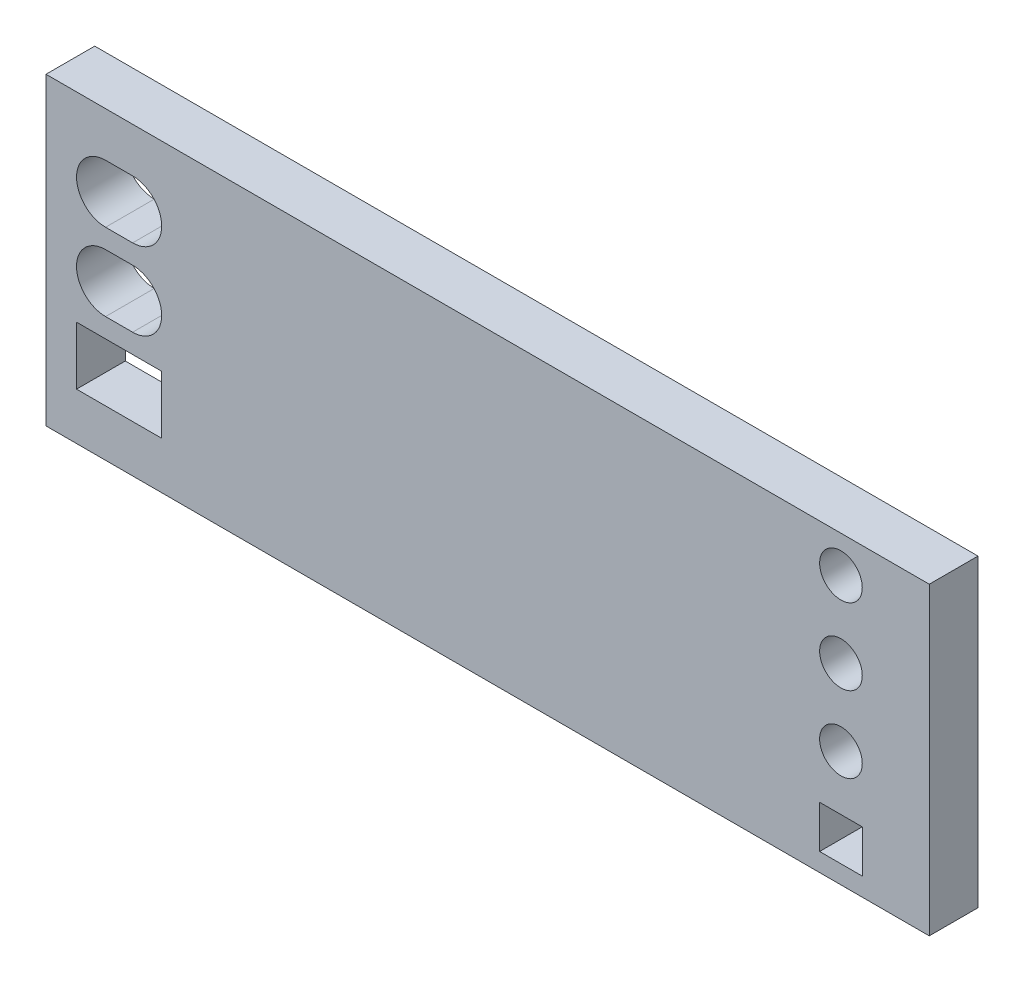
ISO-10303-21;
HEADER;
FILE_DESCRIPTION(('STEP AP214'),'2;1');
FILE_NAME('part.step','',(''),(''),'','','');
FILE_SCHEMA(('AUTOMOTIVE_DESIGN { 1 0 10303 214 1 1 1 1 }'));
ENDSEC;
DATA;
#1=APPLICATION_CONTEXT('core data for automotive mechanical design processes');
#2=APPLICATION_PROTOCOL_DEFINITION('international standard','automotive_design',2000,#1);
#3=PRODUCT_CONTEXT('',#1,'mechanical');
#4=PRODUCT('Part','Part','',(#3));
#5=PRODUCT_RELATED_PRODUCT_CATEGORY('part','',(#4));
#6=PRODUCT_DEFINITION_FORMATION('','',#4);
#7=PRODUCT_DEFINITION_CONTEXT('part definition',#1,'design');
#8=PRODUCT_DEFINITION('design','',#6,#7);
#9=PRODUCT_DEFINITION_SHAPE('','',#8);
#10=(LENGTH_UNIT() NAMED_UNIT(*) SI_UNIT(.MILLI.,.METRE.));
#11=(NAMED_UNIT(*) PLANE_ANGLE_UNIT() SI_UNIT($,.RADIAN.));
#12=(NAMED_UNIT(*) SI_UNIT($,.STERADIAN.) SOLID_ANGLE_UNIT());
#13=UNCERTAINTY_MEASURE_WITH_UNIT(LENGTH_MEASURE(1.E-05),#10,'distance_accuracy_value','');
#14=(GEOMETRIC_REPRESENTATION_CONTEXT(3) GLOBAL_UNCERTAINTY_ASSIGNED_CONTEXT((#13)) GLOBAL_UNIT_ASSIGNED_CONTEXT((#10,
#11,#12)) REPRESENTATION_CONTEXT('',''));
#15=CARTESIAN_POINT('',(0.,0.,0.));
#16=DIRECTION('',(0.,0.,1.));
#17=DIRECTION('',(1.,0.,0.));
#18=AXIS2_PLACEMENT_3D('',#15,#16,#17);
#19=CARTESIAN_POINT('',(0.,0.,1.6));
#20=DIRECTION('',(0.,0.,-1.));
#21=DIRECTION('',(-1.,0.,0.));
#22=AXIS2_PLACEMENT_3D('',#19,#20,#21);
#23=PLANE('',#22);
#24=DIRECTION('',(0.,1.,0.));
#25=VECTOR('',#24,1.);
#26=CARTESIAN_POINT('',(3.797,3.4525,1.6));
#27=LINE('',#26,#25);
#28=CARTESIAN_POINT('',(3.797,1.5475,1.6));
#29=VERTEX_POINT('',#28);
#30=CARTESIAN_POINT('',(3.797,3.4525,1.6));
#31=VERTEX_POINT('',#30);
#32=EDGE_CURVE('E205',#29,#31,#27,.T.);
#33=ORIENTED_EDGE('',*,*,#32,.F.);
#34=DIRECTION('',(1.,0.,0.));
#35=VECTOR('',#34,1.);
#36=CARTESIAN_POINT('',(3.797,1.5475,1.6));
#37=LINE('',#36,#35);
#38=CARTESIAN_POINT('',(1.003,1.5475,1.6));
#39=VERTEX_POINT('',#38);
#40=EDGE_CURVE('E213',#39,#29,#37,.T.);
#41=ORIENTED_EDGE('',*,*,#40,.F.);
#42=DIRECTION('',(0.,-1.,0.));
#43=VECTOR('',#42,1.);
#44=CARTESIAN_POINT('',(1.003,1.5475,1.6));
#45=LINE('',#44,#43);
#46=CARTESIAN_POINT('',(1.003,3.4525,1.6));
#47=VERTEX_POINT('',#46);
#48=EDGE_CURVE('E210',#47,#39,#45,.T.);
#49=ORIENTED_EDGE('',*,*,#48,.F.);
#50=DIRECTION('',(-1.,0.,0.));
#51=VECTOR('',#50,1.);
#52=CARTESIAN_POINT('',(1.003,3.4525,1.6));
#53=LINE('',#52,#51);
#54=EDGE_CURVE('E207',#31,#47,#53,.T.);
#55=ORIENTED_EDGE('',*,*,#54,.F.);
#56=EDGE_LOOP('',(#33,#41,#49,#55));
#57=FACE_BOUND('',#56,.T.);
#58=CARTESIAN_POINT('',(2.8445,5.04,1.6));
#59=DIRECTION('',(0.,0.,1.));
#60=DIRECTION('',(1.,0.,0.));
#61=AXIS2_PLACEMENT_3D('',#58,#59,#60);
#62=CIRCLE('',#61,0.952499999999999);
#63=CARTESIAN_POINT('',(2.8445,4.0875,1.6));
#64=VERTEX_POINT('',#63);
#65=CARTESIAN_POINT('',(2.8445,5.9925,1.6));
#66=VERTEX_POINT('',#65);
#67=EDGE_CURVE('E267',#64,#66,#62,.T.);
#68=ORIENTED_EDGE('',*,*,#67,.F.);
#69=DIRECTION('',(1.,0.,0.));
#70=VECTOR('',#69,1.);
#71=CARTESIAN_POINT('',(2.8445,4.0875,1.6));
#72=LINE('',#71,#70);
#73=CARTESIAN_POINT('',(1.9555,4.0875,1.6));
#74=VERTEX_POINT('',#73);
#75=EDGE_CURVE('E275',#74,#64,#72,.T.);
#76=ORIENTED_EDGE('',*,*,#75,.F.);
#77=CARTESIAN_POINT('',(1.9555,5.04,1.6));
#78=DIRECTION('',(0.,0.,1.));
#79=DIRECTION('',(1.,0.,0.));
#80=AXIS2_PLACEMENT_3D('',#77,#78,#79);
#81=CIRCLE('',#80,0.952499999999999);
#82=CARTESIAN_POINT('',(1.9555,5.9925,1.6));
#83=VERTEX_POINT('',#82);
#84=EDGE_CURVE('E272',#83,#74,#81,.T.);
#85=ORIENTED_EDGE('',*,*,#84,.F.);
#86=DIRECTION('',(-1.,0.,0.));
#87=VECTOR('',#86,1.);
#88=CARTESIAN_POINT('',(1.9555,5.9925,1.6));
#89=LINE('',#88,#87);
#90=EDGE_CURVE('E269',#66,#83,#89,.T.);
#91=ORIENTED_EDGE('',*,*,#90,.F.);
#92=EDGE_LOOP('',(#68,#76,#85,#91));
#93=FACE_BOUND('',#92,.T.);
#94=DIRECTION('',(1.,0.,0.));
#95=VECTOR('',#94,1.);
#96=CARTESIAN_POINT('',(29.,0.,1.6));
#97=LINE('',#96,#95);
#98=CARTESIAN_POINT('',(0.,0.,1.6));
#99=VERTEX_POINT('',#98);
#100=CARTESIAN_POINT('',(29.,0.,1.6));
#101=VERTEX_POINT('',#100);
#102=EDGE_CURVE('E316',#99,#101,#97,.T.);
#103=ORIENTED_EDGE('',*,*,#102,.T.);
#104=DIRECTION('',(0.,1.,0.));
#105=VECTOR('',#104,1.);
#106=CARTESIAN_POINT('',(29.,10.,1.6));
#107=LINE('',#106,#105);
#108=CARTESIAN_POINT('',(29.,10.,1.6));
#109=VERTEX_POINT('',#108);
#110=EDGE_CURVE('E319',#101,#109,#107,.T.);
#111=ORIENTED_EDGE('',*,*,#110,.T.);
#112=DIRECTION('',(-1.,0.,0.));
#113=VECTOR('',#112,1.);
#114=CARTESIAN_POINT('',(0.,10.,1.6));
#115=LINE('',#114,#113);
#116=CARTESIAN_POINT('',(0.,10.,1.6));
#117=VERTEX_POINT('',#116);
#118=EDGE_CURVE('E322',#109,#117,#115,.T.);
#119=ORIENTED_EDGE('',*,*,#118,.T.);
#120=DIRECTION('',(0.,-1.,0.));
#121=VECTOR('',#120,1.);
#122=CARTESIAN_POINT('',(0.,0.,1.6));
#123=LINE('',#122,#121);
#124=EDGE_CURVE('E324',#117,#99,#123,.T.);
#125=ORIENTED_EDGE('',*,*,#124,.T.);
#126=EDGE_LOOP('',(#103,#111,#119,#125));
#127=FACE_BOUND('',#126,.T.);
#128=CARTESIAN_POINT('',(26.1,3.8,1.6));
#129=DIRECTION('',(0.,0.,1.));
#130=DIRECTION('',(1.,0.,0.));
#131=AXIS2_PLACEMENT_3D('',#128,#129,#130);
#132=CIRCLE('',#131,0.699999999999999);
#133=CARTESIAN_POINT('',(26.8,3.8,1.6));
#134=VERTEX_POINT('',#133);
#135=EDGE_CURVE('E310',#134,#134,#132,.T.);
#136=ORIENTED_EDGE('',*,*,#135,.F.);
#137=EDGE_LOOP('',(#136));
#138=FACE_BOUND('',#137,.T.);
#139=CARTESIAN_POINT('',(26.1,6.3,1.6));
#140=DIRECTION('',(0.,0.,1.));
#141=DIRECTION('',(1.,0.,0.));
#142=AXIS2_PLACEMENT_3D('',#139,#140,#141);
#143=CIRCLE('',#142,0.699999999999999);
#144=CARTESIAN_POINT('',(26.8,6.3,1.6));
#145=VERTEX_POINT('',#144);
#146=EDGE_CURVE('E304',#145,#145,#143,.T.);
#147=ORIENTED_EDGE('',*,*,#146,.F.);
#148=EDGE_LOOP('',(#147));
#149=FACE_BOUND('',#148,.T.);
#150=CARTESIAN_POINT('',(26.1,8.8,1.6));
#151=DIRECTION('',(0.,0.,1.));
#152=DIRECTION('',(1.,0.,0.));
#153=AXIS2_PLACEMENT_3D('',#150,#151,#152);
#154=CIRCLE('',#153,0.699999999999999);
#155=CARTESIAN_POINT('',(26.8,8.8,1.6));
#156=VERTEX_POINT('',#155);
#157=EDGE_CURVE('E298',#156,#156,#154,.T.);
#158=ORIENTED_EDGE('',*,*,#157,.F.);
#159=EDGE_LOOP('',(#158));
#160=FACE_BOUND('',#159,.T.);
#161=CARTESIAN_POINT('',(2.8445,7.58,1.6));
#162=DIRECTION('',(0.,0.,1.));
#163=DIRECTION('',(1.,0.,0.));
#164=AXIS2_PLACEMENT_3D('',#161,#162,#163);
#165=CIRCLE('',#164,0.9525);
#166=CARTESIAN_POINT('',(2.8445,6.6275,1.6));
#167=VERTEX_POINT('',#166);
#168=CARTESIAN_POINT('',(2.8445,8.5325,1.6));
#169=VERTEX_POINT('',#168);
#170=EDGE_CURVE('E236',#167,#169,#165,.T.);
#171=ORIENTED_EDGE('',*,*,#170,.F.);
#172=DIRECTION('',(1.,0.,0.));
#173=VECTOR('',#172,1.);
#174=CARTESIAN_POINT('',(2.8445,6.6275,1.6));
#175=LINE('',#174,#173);
#176=CARTESIAN_POINT('',(1.9555,6.6275,1.6));
#177=VERTEX_POINT('',#176);
#178=EDGE_CURVE('E244',#177,#167,#175,.T.);
#179=ORIENTED_EDGE('',*,*,#178,.F.);
#180=CARTESIAN_POINT('',(1.9555,7.58,1.6));
#181=DIRECTION('',(0.,0.,1.));
#182=DIRECTION('',(1.,0.,0.));
#183=AXIS2_PLACEMENT_3D('',#180,#181,#182);
#184=CIRCLE('',#183,0.9525);
#185=CARTESIAN_POINT('',(1.9555,8.5325,1.6));
#186=VERTEX_POINT('',#185);
#187=EDGE_CURVE('E241',#186,#177,#184,.T.);
#188=ORIENTED_EDGE('',*,*,#187,.F.);
#189=DIRECTION('',(-1.,0.,0.));
#190=VECTOR('',#189,1.);
#191=CARTESIAN_POINT('',(1.9555,8.5325,1.6));
#192=LINE('',#191,#190);
#193=EDGE_CURVE('E238',#169,#186,#192,.T.);
#194=ORIENTED_EDGE('',*,*,#193,.F.);
#195=EDGE_LOOP('',(#171,#179,#188,#194));
#196=FACE_BOUND('',#195,.T.);
#197=DIRECTION('',(0.,1.,0.));
#198=VECTOR('',#197,1.);
#199=CARTESIAN_POINT('',(26.8,2.,1.6));
#200=LINE('',#199,#198);
#201=CARTESIAN_POINT('',(26.8,0.6,1.6));
#202=VERTEX_POINT('',#201);
#203=CARTESIAN_POINT('',(26.8,2.,1.6));
#204=VERTEX_POINT('',#203);
#205=EDGE_CURVE('E169',#202,#204,#200,.T.);
#206=ORIENTED_EDGE('',*,*,#205,.F.);
#207=DIRECTION('',(1.,0.,0.));
#208=VECTOR('',#207,1.);
#209=CARTESIAN_POINT('',(26.8,0.6,1.6));
#210=LINE('',#209,#208);
#211=CARTESIAN_POINT('',(25.4,0.6,1.6));
#212=VERTEX_POINT('',#211);
#213=EDGE_CURVE('E191',#212,#202,#210,.T.);
#214=ORIENTED_EDGE('',*,*,#213,.F.);
#215=DIRECTION('',(0.,-1.,0.));
#216=VECTOR('',#215,1.);
#217=CARTESIAN_POINT('',(25.4,0.6,1.6));
#218=LINE('',#217,#216);
#219=CARTESIAN_POINT('',(25.4,2.,1.6));
#220=VERTEX_POINT('',#219);
#221=EDGE_CURVE('E189',#220,#212,#218,.T.);
#222=ORIENTED_EDGE('',*,*,#221,.F.);
#223=DIRECTION('',(-1.,0.,0.));
#224=VECTOR('',#223,1.);
#225=CARTESIAN_POINT('',(25.4,2.,1.6));
#226=LINE('',#225,#224);
#227=EDGE_CURVE('E177',#204,#220,#226,.T.);
#228=ORIENTED_EDGE('',*,*,#227,.F.);
#229=EDGE_LOOP('',(#206,#214,#222,#228));
#230=FACE_BOUND('',#229,.T.);
#231=ADVANCED_FACE('F32',(#57,#93,#127,#138,#149,#160,#196,#230),#23,.F.);
#232=CARTESIAN_POINT('',(0.,0.,0.));
#233=DIRECTION('',(0.,0.,-1.));
#234=DIRECTION('',(-1.,0.,0.));
#235=AXIS2_PLACEMENT_3D('',#232,#233,#234);
#236=PLANE('',#235);
#237=CARTESIAN_POINT('',(26.1,6.3,0.));
#238=DIRECTION('',(0.,0.,1.));
#239=DIRECTION('',(1.,0.,0.));
#240=AXIS2_PLACEMENT_3D('',#237,#238,#239);
#241=CIRCLE('',#240,0.699999999999999);
#242=CARTESIAN_POINT('',(26.8,6.3,0.));
#243=VERTEX_POINT('',#242);
#244=EDGE_CURVE('E301',#243,#243,#241,.T.);
#245=ORIENTED_EDGE('',*,*,#244,.T.);
#246=EDGE_LOOP('',(#245));
#247=FACE_BOUND('',#246,.T.);
#248=DIRECTION('',(1.,0.,0.));
#249=VECTOR('',#248,1.);
#250=CARTESIAN_POINT('',(29.,0.,0.));
#251=LINE('',#250,#249);
#252=CARTESIAN_POINT('',(0.,0.,0.));
#253=VERTEX_POINT('',#252);
#254=CARTESIAN_POINT('',(29.,0.,0.));
#255=VERTEX_POINT('',#254);
#256=EDGE_CURVE('E313',#253,#255,#251,.T.);
#257=ORIENTED_EDGE('',*,*,#256,.F.);
#258=DIRECTION('',(0.,-1.,0.));
#259=VECTOR('',#258,1.);
#260=CARTESIAN_POINT('',(0.,0.,0.));
#261=LINE('',#260,#259);
#262=CARTESIAN_POINT('',(0.,10.,0.));
#263=VERTEX_POINT('',#262);
#264=EDGE_CURVE('E320',#263,#253,#261,.T.);
#265=ORIENTED_EDGE('',*,*,#264,.F.);
#266=DIRECTION('',(-1.,0.,0.));
#267=VECTOR('',#266,1.);
#268=CARTESIAN_POINT('',(0.,10.,0.));
#269=LINE('',#268,#267);
#270=CARTESIAN_POINT('',(29.,10.,0.));
#271=VERTEX_POINT('',#270);
#272=EDGE_CURVE('E331',#271,#263,#269,.T.);
#273=ORIENTED_EDGE('',*,*,#272,.F.);
#274=DIRECTION('',(0.,1.,0.));
#275=VECTOR('',#274,1.);
#276=CARTESIAN_POINT('',(29.,10.,0.));
#277=LINE('',#276,#275);
#278=EDGE_CURVE('E329',#255,#271,#277,.T.);
#279=ORIENTED_EDGE('',*,*,#278,.F.);
#280=EDGE_LOOP('',(#257,#265,#273,#279));
#281=FACE_BOUND('',#280,.T.);
#282=CARTESIAN_POINT('',(26.1,3.8,0.));
#283=DIRECTION('',(0.,0.,1.));
#284=DIRECTION('',(1.,0.,0.));
#285=AXIS2_PLACEMENT_3D('',#282,#283,#284);
#286=CIRCLE('',#285,0.699999999999999);
#287=CARTESIAN_POINT('',(26.8,3.8,0.));
#288=VERTEX_POINT('',#287);
#289=EDGE_CURVE('E307',#288,#288,#286,.T.);
#290=ORIENTED_EDGE('',*,*,#289,.T.);
#291=EDGE_LOOP('',(#290));
#292=FACE_BOUND('',#291,.T.);
#293=CARTESIAN_POINT('',(26.1,8.8,0.));
#294=DIRECTION('',(0.,0.,1.));
#295=DIRECTION('',(1.,0.,0.));
#296=AXIS2_PLACEMENT_3D('',#293,#294,#295);
#297=CIRCLE('',#296,0.699999999999999);
#298=CARTESIAN_POINT('',(26.8,8.8,0.));
#299=VERTEX_POINT('',#298);
#300=EDGE_CURVE('E297',#299,#299,#297,.T.);
#301=ORIENTED_EDGE('',*,*,#300,.T.);
#302=EDGE_LOOP('',(#301));
#303=FACE_BOUND('',#302,.T.);
#304=DIRECTION('',(1.,0.,0.));
#305=VECTOR('',#304,1.);
#306=CARTESIAN_POINT('',(2.8445,4.0875,0.));
#307=LINE('',#306,#305);
#308=CARTESIAN_POINT('',(1.9555,4.0875,0.));
#309=VERTEX_POINT('',#308);
#310=CARTESIAN_POINT('',(2.8445,4.0875,0.));
#311=VERTEX_POINT('',#310);
#312=EDGE_CURVE('E270',#309,#311,#307,.T.);
#313=ORIENTED_EDGE('',*,*,#312,.T.);
#314=CARTESIAN_POINT('',(2.8445,5.04,0.));
#315=DIRECTION('',(0.,0.,1.));
#316=DIRECTION('',(1.,0.,0.));
#317=AXIS2_PLACEMENT_3D('',#314,#315,#316);
#318=CIRCLE('',#317,0.952499999999999);
#319=CARTESIAN_POINT('',(2.8445,5.9925,0.));
#320=VERTEX_POINT('',#319);
#321=EDGE_CURVE('E266',#311,#320,#318,.T.);
#322=ORIENTED_EDGE('',*,*,#321,.T.);
#323=DIRECTION('',(-1.,0.,0.));
#324=VECTOR('',#323,1.);
#325=CARTESIAN_POINT('',(1.9555,5.9925,0.));
#326=LINE('',#325,#324);
#327=CARTESIAN_POINT('',(1.9555,5.9925,0.));
#328=VERTEX_POINT('',#327);
#329=EDGE_CURVE('E280',#320,#328,#326,.T.);
#330=ORIENTED_EDGE('',*,*,#329,.T.);
#331=CARTESIAN_POINT('',(1.9555,5.04,0.));
#332=DIRECTION('',(0.,0.,1.));
#333=DIRECTION('',(1.,0.,0.));
#334=AXIS2_PLACEMENT_3D('',#331,#332,#333);
#335=CIRCLE('',#334,0.952499999999999);
#336=EDGE_CURVE('E283',#328,#309,#335,.T.);
#337=ORIENTED_EDGE('',*,*,#336,.T.);
#338=EDGE_LOOP('',(#313,#322,#330,#337));
#339=FACE_BOUND('',#338,.T.);
#340=DIRECTION('',(1.,0.,0.));
#341=VECTOR('',#340,1.);
#342=CARTESIAN_POINT('',(2.8445,6.6275,0.));
#343=LINE('',#342,#341);
#344=CARTESIAN_POINT('',(1.9555,6.6275,0.));
#345=VERTEX_POINT('',#344);
#346=CARTESIAN_POINT('',(2.8445,6.6275,0.));
#347=VERTEX_POINT('',#346);
#348=EDGE_CURVE('E239',#345,#347,#343,.T.);
#349=ORIENTED_EDGE('',*,*,#348,.T.);
#350=CARTESIAN_POINT('',(2.8445,7.58,0.));
#351=DIRECTION('',(0.,0.,1.));
#352=DIRECTION('',(1.,0.,0.));
#353=AXIS2_PLACEMENT_3D('',#350,#351,#352);
#354=CIRCLE('',#353,0.9525);
#355=CARTESIAN_POINT('',(2.8445,8.5325,0.));
#356=VERTEX_POINT('',#355);
#357=EDGE_CURVE('E235',#347,#356,#354,.T.);
#358=ORIENTED_EDGE('',*,*,#357,.T.);
#359=DIRECTION('',(-1.,0.,0.));
#360=VECTOR('',#359,1.);
#361=CARTESIAN_POINT('',(1.9555,8.5325,0.));
#362=LINE('',#361,#360);
#363=CARTESIAN_POINT('',(1.9555,8.5325,0.));
#364=VERTEX_POINT('',#363);
#365=EDGE_CURVE('E249',#356,#364,#362,.T.);
#366=ORIENTED_EDGE('',*,*,#365,.T.);
#367=CARTESIAN_POINT('',(1.9555,7.58,0.));
#368=DIRECTION('',(0.,0.,1.));
#369=DIRECTION('',(1.,0.,0.));
#370=AXIS2_PLACEMENT_3D('',#367,#368,#369);
#371=CIRCLE('',#370,0.9525);
#372=EDGE_CURVE('E252',#364,#345,#371,.T.);
#373=ORIENTED_EDGE('',*,*,#372,.T.);
#374=EDGE_LOOP('',(#349,#358,#366,#373));
#375=FACE_BOUND('',#374,.T.);
#376=DIRECTION('',(1.,0.,0.));
#377=VECTOR('',#376,1.);
#378=CARTESIAN_POINT('',(3.797,1.5475,0.));
#379=LINE('',#378,#377);
#380=CARTESIAN_POINT('',(1.003,1.5475,0.));
#381=VERTEX_POINT('',#380);
#382=CARTESIAN_POINT('',(3.797,1.5475,0.));
#383=VERTEX_POINT('',#382);
#384=EDGE_CURVE('E208',#381,#383,#379,.T.);
#385=ORIENTED_EDGE('',*,*,#384,.T.);
#386=DIRECTION('',(0.,1.,0.));
#387=VECTOR('',#386,1.);
#388=CARTESIAN_POINT('',(3.797,3.4525,0.));
#389=LINE('',#388,#387);
#390=CARTESIAN_POINT('',(3.797,3.4525,0.));
#391=VERTEX_POINT('',#390);
#392=EDGE_CURVE('E185',#383,#391,#389,.T.);
#393=ORIENTED_EDGE('',*,*,#392,.T.);
#394=DIRECTION('',(-1.,0.,0.));
#395=VECTOR('',#394,1.);
#396=CARTESIAN_POINT('',(1.003,3.4525,0.));
#397=LINE('',#396,#395);
#398=CARTESIAN_POINT('',(1.003,3.4525,0.));
#399=VERTEX_POINT('',#398);
#400=EDGE_CURVE('E218',#391,#399,#397,.T.);
#401=ORIENTED_EDGE('',*,*,#400,.T.);
#402=DIRECTION('',(0.,-1.,0.));
#403=VECTOR('',#402,1.);
#404=CARTESIAN_POINT('',(1.003,1.5475,0.));
#405=LINE('',#404,#403);
#406=EDGE_CURVE('E221',#399,#381,#405,.T.);
#407=ORIENTED_EDGE('',*,*,#406,.T.);
#408=EDGE_LOOP('',(#385,#393,#401,#407));
#409=FACE_BOUND('',#408,.T.);
#410=DIRECTION('',(1.,0.,0.));
#411=VECTOR('',#410,1.);
#412=CARTESIAN_POINT('',(26.8,0.6,0.));
#413=LINE('',#412,#411);
#414=CARTESIAN_POINT('',(25.4,0.6,0.));
#415=VERTEX_POINT('',#414);
#416=CARTESIAN_POINT('',(26.8,0.6,0.));
#417=VERTEX_POINT('',#416);
#418=EDGE_CURVE('E178',#415,#417,#413,.T.);
#419=ORIENTED_EDGE('',*,*,#418,.T.);
#420=DIRECTION('',(0.,1.,0.));
#421=VECTOR('',#420,1.);
#422=CARTESIAN_POINT('',(26.8,2.,0.));
#423=LINE('',#422,#421);
#424=CARTESIAN_POINT('',(26.8,2.,0.));
#425=VERTEX_POINT('',#424);
#426=EDGE_CURVE('E55',#417,#425,#423,.T.);
#427=ORIENTED_EDGE('',*,*,#426,.T.);
#428=DIRECTION('',(-1.,0.,0.));
#429=VECTOR('',#428,1.);
#430=CARTESIAN_POINT('',(25.4,2.,0.));
#431=LINE('',#430,#429);
#432=CARTESIAN_POINT('',(25.4,2.,0.));
#433=VERTEX_POINT('',#432);
#434=EDGE_CURVE('E184',#425,#433,#431,.T.);
#435=ORIENTED_EDGE('',*,*,#434,.T.);
#436=DIRECTION('',(0.,-1.,0.));
#437=VECTOR('',#436,1.);
#438=CARTESIAN_POINT('',(25.4,0.6,0.));
#439=LINE('',#438,#437);
#440=EDGE_CURVE('E197',#433,#415,#439,.T.);
#441=ORIENTED_EDGE('',*,*,#440,.T.);
#442=EDGE_LOOP('',(#419,#427,#435,#441));
#443=FACE_BOUND('',#442,.T.);
#444=ADVANCED_FACE('F349',(#247,#281,#292,#303,#339,#375,#409,#443),#236,.T.);
#445=CARTESIAN_POINT('',(29.,0.,1.6));
#446=DIRECTION('',(0.,1.,0.));
#447=DIRECTION('',(0.,0.,1.));
#448=AXIS2_PLACEMENT_3D('',#445,#446,#447);
#449=PLANE('',#448);
#450=ORIENTED_EDGE('',*,*,#256,.T.);
#451=DIRECTION('',(0.,0.,-1.));
#452=VECTOR('',#451,1.);
#453=CARTESIAN_POINT('',(29.,0.,1.6));
#454=LINE('',#453,#452);
#455=EDGE_CURVE('E11',#101,#255,#454,.T.);
#456=ORIENTED_EDGE('',*,*,#455,.F.);
#457=ORIENTED_EDGE('',*,*,#102,.F.);
#458=DIRECTION('',(0.,0.,-1.));
#459=VECTOR('',#458,1.);
#460=CARTESIAN_POINT('',(0.,0.,1.6));
#461=LINE('',#460,#459);
#462=EDGE_CURVE('E326',#99,#253,#461,.T.);
#463=ORIENTED_EDGE('',*,*,#462,.T.);
#464=EDGE_LOOP('',(#450,#456,#457,#463));
#465=FACE_BOUND('',#464,.T.);
#466=ADVANCED_FACE('F34',(#465),#449,.F.);
#467=CARTESIAN_POINT('',(29.,10.,1.6));
#468=DIRECTION('',(-1.,0.,0.));
#469=DIRECTION('',(0.,0.,1.));
#470=AXIS2_PLACEMENT_3D('',#467,#468,#469);
#471=PLANE('',#470);
#472=ORIENTED_EDGE('',*,*,#278,.T.);
#473=DIRECTION('',(0.,0.,-1.));
#474=VECTOR('',#473,1.);
#475=CARTESIAN_POINT('',(29.,10.,1.6));
#476=LINE('',#475,#474);
#477=EDGE_CURVE('E40',#109,#271,#476,.T.);
#478=ORIENTED_EDGE('',*,*,#477,.F.);
#479=ORIENTED_EDGE('',*,*,#110,.F.);
#480=ORIENTED_EDGE('',*,*,#455,.T.);
#481=EDGE_LOOP('',(#472,#478,#479,#480));
#482=FACE_BOUND('',#481,.T.);
#483=ADVANCED_FACE('F360',(#482),#471,.F.);
#484=CARTESIAN_POINT('',(0.,10.,1.6));
#485=DIRECTION('',(0.,-1.,0.));
#486=DIRECTION('',(0.,0.,-1.));
#487=AXIS2_PLACEMENT_3D('',#484,#485,#486);
#488=PLANE('',#487);
#489=ORIENTED_EDGE('',*,*,#272,.T.);
#490=DIRECTION('',(0.,0.,-1.));
#491=VECTOR('',#490,1.);
#492=CARTESIAN_POINT('',(0.,10.,1.6));
#493=LINE('',#492,#491);
#494=EDGE_CURVE('E336',#117,#263,#493,.T.);
#495=ORIENTED_EDGE('',*,*,#494,.F.);
#496=ORIENTED_EDGE('',*,*,#118,.F.);
#497=ORIENTED_EDGE('',*,*,#477,.T.);
#498=EDGE_LOOP('',(#489,#495,#496,#497));
#499=FACE_BOUND('',#498,.T.);
#500=ADVANCED_FACE('F343',(#499),#488,.F.);
#501=CARTESIAN_POINT('',(0.,0.,1.6));
#502=DIRECTION('',(1.,0.,0.));
#503=DIRECTION('',(0.,0.,-1.));
#504=AXIS2_PLACEMENT_3D('',#501,#502,#503);
#505=PLANE('',#504);
#506=ORIENTED_EDGE('',*,*,#264,.T.);
#507=ORIENTED_EDGE('',*,*,#462,.F.);
#508=ORIENTED_EDGE('',*,*,#124,.F.);
#509=ORIENTED_EDGE('',*,*,#494,.T.);
#510=EDGE_LOOP('',(#506,#507,#508,#509));
#511=FACE_BOUND('',#510,.T.);
#512=ADVANCED_FACE('F353',(#511),#505,.F.);
#513=CARTESIAN_POINT('',(26.1,3.8,1.6));
#514=DIRECTION('',(0.,0.,-1.));
#515=DIRECTION('',(-1.,0.,0.));
#516=AXIS2_PLACEMENT_3D('',#513,#514,#515);
#517=CYLINDRICAL_SURFACE('',#516,0.699999999999999);
#518=ORIENTED_EDGE('',*,*,#135,.T.);
#519=EDGE_LOOP('',(#518));
#520=FACE_BOUND('',#519,.T.);
#521=ORIENTED_EDGE('',*,*,#289,.F.);
#522=EDGE_LOOP('',(#521));
#523=FACE_BOUND('',#522,.T.);
#524=ADVANCED_FACE('F378',(#520,#523),#517,.F.);
#525=CARTESIAN_POINT('',(26.1,6.3,1.6));
#526=DIRECTION('',(0.,0.,-1.));
#527=DIRECTION('',(-1.,0.,0.));
#528=AXIS2_PLACEMENT_3D('',#525,#526,#527);
#529=CYLINDRICAL_SURFACE('',#528,0.699999999999999);
#530=ORIENTED_EDGE('',*,*,#146,.T.);
#531=EDGE_LOOP('',(#530));
#532=FACE_BOUND('',#531,.T.);
#533=ORIENTED_EDGE('',*,*,#244,.F.);
#534=EDGE_LOOP('',(#533));
#535=FACE_BOUND('',#534,.T.);
#536=ADVANCED_FACE('F385',(#532,#535),#529,.F.);
#537=CARTESIAN_POINT('',(26.1,8.8,1.6));
#538=DIRECTION('',(0.,0.,-1.));
#539=DIRECTION('',(-1.,0.,0.));
#540=AXIS2_PLACEMENT_3D('',#537,#538,#539);
#541=CYLINDRICAL_SURFACE('',#540,0.699999999999999);
#542=ORIENTED_EDGE('',*,*,#157,.T.);
#543=EDGE_LOOP('',(#542));
#544=FACE_BOUND('',#543,.T.);
#545=ORIENTED_EDGE('',*,*,#300,.F.);
#546=EDGE_LOOP('',(#545));
#547=FACE_BOUND('',#546,.T.);
#548=ADVANCED_FACE('F390',(#544,#547),#541,.F.);
#549=CARTESIAN_POINT('',(2.8445,5.04,1.6));
#550=DIRECTION('',(0.,0.,-1.));
#551=DIRECTION('',(-1.,0.,0.));
#552=AXIS2_PLACEMENT_3D('',#549,#550,#551);
#553=CYLINDRICAL_SURFACE('',#552,0.952499999999999);
#554=ORIENTED_EDGE('',*,*,#321,.F.);
#555=DIRECTION('',(0.,0.,-1.));
#556=VECTOR('',#555,1.);
#557=CARTESIAN_POINT('',(2.8445,4.0875,1.6));
#558=LINE('',#557,#556);
#559=EDGE_CURVE('E277',#64,#311,#558,.T.);
#560=ORIENTED_EDGE('',*,*,#559,.F.);
#561=ORIENTED_EDGE('',*,*,#67,.T.);
#562=DIRECTION('',(0.,0.,-1.));
#563=VECTOR('',#562,1.);
#564=CARTESIAN_POINT('',(2.8445,5.9925,1.6));
#565=LINE('',#564,#563);
#566=EDGE_CURVE('E294',#66,#320,#565,.T.);
#567=ORIENTED_EDGE('',*,*,#566,.T.);
#568=EDGE_LOOP('',(#554,#560,#561,#567));
#569=FACE_BOUND('',#568,.T.);
#570=ADVANCED_FACE('F462',(#569),#553,.F.);
#571=CARTESIAN_POINT('',(1.9555,5.9925,1.6));
#572=DIRECTION('',(0.,-1.,0.));
#573=DIRECTION('',(0.,0.,-1.));
#574=AXIS2_PLACEMENT_3D('',#571,#572,#573);
#575=PLANE('',#574);
#576=ORIENTED_EDGE('',*,*,#329,.F.);
#577=ORIENTED_EDGE('',*,*,#566,.F.);
#578=ORIENTED_EDGE('',*,*,#90,.T.);
#579=DIRECTION('',(0.,0.,-1.));
#580=VECTOR('',#579,1.);
#581=CARTESIAN_POINT('',(1.9555,5.9925,1.6));
#582=LINE('',#581,#580);
#583=EDGE_CURVE('E292',#83,#328,#582,.T.);
#584=ORIENTED_EDGE('',*,*,#583,.T.);
#585=EDGE_LOOP('',(#576,#577,#578,#584));
#586=FACE_BOUND('',#585,.T.);
#587=ADVANCED_FACE('F458',(#586),#575,.T.);
#588=CARTESIAN_POINT('',(1.9555,5.04,1.6));
#589=DIRECTION('',(0.,0.,-1.));
#590=DIRECTION('',(-1.,0.,0.));
#591=AXIS2_PLACEMENT_3D('',#588,#589,#590);
#592=CYLINDRICAL_SURFACE('',#591,0.952499999999999);
#593=ORIENTED_EDGE('',*,*,#336,.F.);
#594=ORIENTED_EDGE('',*,*,#583,.F.);
#595=ORIENTED_EDGE('',*,*,#84,.T.);
#596=DIRECTION('',(0.,0.,-1.));
#597=VECTOR('',#596,1.);
#598=CARTESIAN_POINT('',(1.9555,4.0875,1.6));
#599=LINE('',#598,#597);
#600=EDGE_CURVE('E290',#74,#309,#599,.T.);
#601=ORIENTED_EDGE('',*,*,#600,.T.);
#602=EDGE_LOOP('',(#593,#594,#595,#601));
#603=FACE_BOUND('',#602,.T.);
#604=ADVANCED_FACE('F454',(#603),#592,.F.);
#605=CARTESIAN_POINT('',(2.8445,4.0875,1.6));
#606=DIRECTION('',(0.,1.,0.));
#607=DIRECTION('',(0.,0.,1.));
#608=AXIS2_PLACEMENT_3D('',#605,#606,#607);
#609=PLANE('',#608);
#610=ORIENTED_EDGE('',*,*,#312,.F.);
#611=ORIENTED_EDGE('',*,*,#600,.F.);
#612=ORIENTED_EDGE('',*,*,#75,.T.);
#613=ORIENTED_EDGE('',*,*,#559,.T.);
#614=EDGE_LOOP('',(#610,#611,#612,#613));
#615=FACE_BOUND('',#614,.T.);
#616=ADVANCED_FACE('F450',(#615),#609,.T.);
#617=CARTESIAN_POINT('',(2.8445,7.58,1.6));
#618=DIRECTION('',(0.,0.,-1.));
#619=DIRECTION('',(-1.,0.,0.));
#620=AXIS2_PLACEMENT_3D('',#617,#618,#619);
#621=CYLINDRICAL_SURFACE('',#620,0.9525);
#622=ORIENTED_EDGE('',*,*,#357,.F.);
#623=DIRECTION('',(0.,0.,-1.));
#624=VECTOR('',#623,1.);
#625=CARTESIAN_POINT('',(2.8445,6.6275,1.6));
#626=LINE('',#625,#624);
#627=EDGE_CURVE('E246',#167,#347,#626,.T.);
#628=ORIENTED_EDGE('',*,*,#627,.F.);
#629=ORIENTED_EDGE('',*,*,#170,.T.);
#630=DIRECTION('',(0.,0.,-1.));
#631=VECTOR('',#630,1.);
#632=CARTESIAN_POINT('',(2.8445,8.5325,1.6));
#633=LINE('',#632,#631);
#634=EDGE_CURVE('E263',#169,#356,#633,.T.);
#635=ORIENTED_EDGE('',*,*,#634,.T.);
#636=EDGE_LOOP('',(#622,#628,#629,#635));
#637=FACE_BOUND('',#636,.T.);
#638=ADVANCED_FACE('F446',(#637),#621,.F.);
#639=CARTESIAN_POINT('',(1.9555,8.5325,1.6));
#640=DIRECTION('',(0.,-1.,0.));
#641=DIRECTION('',(0.,0.,-1.));
#642=AXIS2_PLACEMENT_3D('',#639,#640,#641);
#643=PLANE('',#642);
#644=ORIENTED_EDGE('',*,*,#365,.F.);
#645=ORIENTED_EDGE('',*,*,#634,.F.);
#646=ORIENTED_EDGE('',*,*,#193,.T.);
#647=DIRECTION('',(0.,0.,-1.));
#648=VECTOR('',#647,1.);
#649=CARTESIAN_POINT('',(1.9555,8.5325,1.6));
#650=LINE('',#649,#648);
#651=EDGE_CURVE('E261',#186,#364,#650,.T.);
#652=ORIENTED_EDGE('',*,*,#651,.T.);
#653=EDGE_LOOP('',(#644,#645,#646,#652));
#654=FACE_BOUND('',#653,.T.);
#655=ADVANCED_FACE('F442',(#654),#643,.T.);
#656=CARTESIAN_POINT('',(1.9555,7.58,1.6));
#657=DIRECTION('',(0.,0.,-1.));
#658=DIRECTION('',(-1.,0.,0.));
#659=AXIS2_PLACEMENT_3D('',#656,#657,#658);
#660=CYLINDRICAL_SURFACE('',#659,0.9525);
#661=ORIENTED_EDGE('',*,*,#372,.F.);
#662=ORIENTED_EDGE('',*,*,#651,.F.);
#663=ORIENTED_EDGE('',*,*,#187,.T.);
#664=DIRECTION('',(0.,0.,-1.));
#665=VECTOR('',#664,1.);
#666=CARTESIAN_POINT('',(1.9555,6.6275,1.6));
#667=LINE('',#666,#665);
#668=EDGE_CURVE('E259',#177,#345,#667,.T.);
#669=ORIENTED_EDGE('',*,*,#668,.T.);
#670=EDGE_LOOP('',(#661,#662,#663,#669));
#671=FACE_BOUND('',#670,.T.);
#672=ADVANCED_FACE('F438',(#671),#660,.F.);
#673=CARTESIAN_POINT('',(2.8445,6.6275,1.6));
#674=DIRECTION('',(0.,1.,0.));
#675=DIRECTION('',(0.,0.,1.));
#676=AXIS2_PLACEMENT_3D('',#673,#674,#675);
#677=PLANE('',#676);
#678=ORIENTED_EDGE('',*,*,#348,.F.);
#679=ORIENTED_EDGE('',*,*,#668,.F.);
#680=ORIENTED_EDGE('',*,*,#178,.T.);
#681=ORIENTED_EDGE('',*,*,#627,.T.);
#682=EDGE_LOOP('',(#678,#679,#680,#681));
#683=FACE_BOUND('',#682,.T.);
#684=ADVANCED_FACE('F434',(#683),#677,.T.);
#685=CARTESIAN_POINT('',(3.797,3.4525,1.6));
#686=DIRECTION('',(-1.,0.,0.));
#687=DIRECTION('',(0.,0.,1.));
#688=AXIS2_PLACEMENT_3D('',#685,#686,#687);
#689=PLANE('',#688);
#690=ORIENTED_EDGE('',*,*,#392,.F.);
#691=DIRECTION('',(0.,0.,-1.));
#692=VECTOR('',#691,1.);
#693=CARTESIAN_POINT('',(3.797,1.5475,1.6));
#694=LINE('',#693,#692);
#695=EDGE_CURVE('E215',#29,#383,#694,.T.);
#696=ORIENTED_EDGE('',*,*,#695,.F.);
#697=ORIENTED_EDGE('',*,*,#32,.T.);
#698=DIRECTION('',(0.,0.,-1.));
#699=VECTOR('',#698,1.);
#700=CARTESIAN_POINT('',(3.797,3.4525,1.6));
#701=LINE('',#700,#699);
#702=EDGE_CURVE('E232',#31,#391,#701,.T.);
#703=ORIENTED_EDGE('',*,*,#702,.T.);
#704=EDGE_LOOP('',(#690,#696,#697,#703));
#705=FACE_BOUND('',#704,.T.);
#706=ADVANCED_FACE('F430',(#705),#689,.T.);
#707=CARTESIAN_POINT('',(1.003,3.4525,1.6));
#708=DIRECTION('',(0.,-1.,0.));
#709=DIRECTION('',(0.,0.,-1.));
#710=AXIS2_PLACEMENT_3D('',#707,#708,#709);
#711=PLANE('',#710);
#712=ORIENTED_EDGE('',*,*,#400,.F.);
#713=ORIENTED_EDGE('',*,*,#702,.F.);
#714=ORIENTED_EDGE('',*,*,#54,.T.);
#715=DIRECTION('',(0.,0.,-1.));
#716=VECTOR('',#715,1.);
#717=CARTESIAN_POINT('',(1.003,3.4525,1.6));
#718=LINE('',#717,#716);
#719=EDGE_CURVE('E230',#47,#399,#718,.T.);
#720=ORIENTED_EDGE('',*,*,#719,.T.);
#721=EDGE_LOOP('',(#712,#713,#714,#720));
#722=FACE_BOUND('',#721,.T.);
#723=ADVANCED_FACE('F426',(#722),#711,.T.);
#724=CARTESIAN_POINT('',(1.003,1.5475,1.6));
#725=DIRECTION('',(1.,0.,0.));
#726=DIRECTION('',(0.,0.,-1.));
#727=AXIS2_PLACEMENT_3D('',#724,#725,#726);
#728=PLANE('',#727);
#729=ORIENTED_EDGE('',*,*,#406,.F.);
#730=ORIENTED_EDGE('',*,*,#719,.F.);
#731=ORIENTED_EDGE('',*,*,#48,.T.);
#732=DIRECTION('',(0.,0.,-1.));
#733=VECTOR('',#732,1.);
#734=CARTESIAN_POINT('',(1.003,1.5475,1.6));
#735=LINE('',#734,#733);
#736=EDGE_CURVE('E228',#39,#381,#735,.T.);
#737=ORIENTED_EDGE('',*,*,#736,.T.);
#738=EDGE_LOOP('',(#729,#730,#731,#737));
#739=FACE_BOUND('',#738,.T.);
#740=ADVANCED_FACE('F422',(#739),#728,.T.);
#741=CARTESIAN_POINT('',(3.797,1.5475,1.6));
#742=DIRECTION('',(0.,1.,0.));
#743=DIRECTION('',(0.,0.,1.));
#744=AXIS2_PLACEMENT_3D('',#741,#742,#743);
#745=PLANE('',#744);
#746=ORIENTED_EDGE('',*,*,#384,.F.);
#747=ORIENTED_EDGE('',*,*,#736,.F.);
#748=ORIENTED_EDGE('',*,*,#40,.T.);
#749=ORIENTED_EDGE('',*,*,#695,.T.);
#750=EDGE_LOOP('',(#746,#747,#748,#749));
#751=FACE_BOUND('',#750,.T.);
#752=ADVANCED_FACE('F419',(#751),#745,.T.);
#753=CARTESIAN_POINT('',(26.8,2.,1.6));
#754=DIRECTION('',(-1.,0.,0.));
#755=DIRECTION('',(0.,0.,1.));
#756=AXIS2_PLACEMENT_3D('',#753,#754,#755);
#757=PLANE('',#756);
#758=ORIENTED_EDGE('',*,*,#426,.F.);
#759=DIRECTION('',(0.,0.,-1.));
#760=VECTOR('',#759,1.);
#761=CARTESIAN_POINT('',(26.8,0.6,1.6));
#762=LINE('',#761,#760);
#763=EDGE_CURVE('E173',#202,#417,#762,.T.);
#764=ORIENTED_EDGE('',*,*,#763,.F.);
#765=ORIENTED_EDGE('',*,*,#205,.T.);
#766=DIRECTION('',(0.,0.,-1.));
#767=VECTOR('',#766,1.);
#768=CARTESIAN_POINT('',(26.8,2.,1.6));
#769=LINE('',#768,#767);
#770=EDGE_CURVE('E172',#204,#425,#769,.T.);
#771=ORIENTED_EDGE('',*,*,#770,.T.);
#772=EDGE_LOOP('',(#758,#764,#765,#771));
#773=FACE_BOUND('',#772,.T.);
#774=ADVANCED_FACE('F171',(#773),#757,.T.);
#775=CARTESIAN_POINT('',(25.4,2.,1.6));
#776=DIRECTION('',(0.,-1.,0.));
#777=DIRECTION('',(0.,0.,-1.));
#778=AXIS2_PLACEMENT_3D('',#775,#776,#777);
#779=PLANE('',#778);
#780=ORIENTED_EDGE('',*,*,#434,.F.);
#781=ORIENTED_EDGE('',*,*,#770,.F.);
#782=ORIENTED_EDGE('',*,*,#227,.T.);
#783=DIRECTION('',(0.,0.,-1.));
#784=VECTOR('',#783,1.);
#785=CARTESIAN_POINT('',(25.4,2.,1.6));
#786=LINE('',#785,#784);
#787=EDGE_CURVE('E186',#220,#433,#786,.T.);
#788=ORIENTED_EDGE('',*,*,#787,.T.);
#789=EDGE_LOOP('',(#780,#781,#782,#788));
#790=FACE_BOUND('',#789,.T.);
#791=ADVANCED_FACE('F181',(#790),#779,.T.);
#792=CARTESIAN_POINT('',(25.4,0.6,1.6));
#793=DIRECTION('',(1.,0.,0.));
#794=DIRECTION('',(0.,0.,-1.));
#795=AXIS2_PLACEMENT_3D('',#792,#793,#794);
#796=PLANE('',#795);
#797=ORIENTED_EDGE('',*,*,#440,.F.);
#798=ORIENTED_EDGE('',*,*,#787,.F.);
#799=ORIENTED_EDGE('',*,*,#221,.T.);
#800=DIRECTION('',(0.,0.,-1.));
#801=VECTOR('',#800,1.);
#802=CARTESIAN_POINT('',(25.4,0.6,1.6));
#803=LINE('',#802,#801);
#804=EDGE_CURVE('E47',#212,#415,#803,.T.);
#805=ORIENTED_EDGE('',*,*,#804,.T.);
#806=EDGE_LOOP('',(#797,#798,#799,#805));
#807=FACE_BOUND('',#806,.T.);
#808=ADVANCED_FACE('F407',(#807),#796,.T.);
#809=CARTESIAN_POINT('',(26.8,0.6,1.6));
#810=DIRECTION('',(0.,1.,0.));
#811=DIRECTION('',(0.,0.,1.));
#812=AXIS2_PLACEMENT_3D('',#809,#810,#811);
#813=PLANE('',#812);
#814=ORIENTED_EDGE('',*,*,#418,.F.);
#815=ORIENTED_EDGE('',*,*,#804,.F.);
#816=ORIENTED_EDGE('',*,*,#213,.T.);
#817=ORIENTED_EDGE('',*,*,#763,.T.);
#818=EDGE_LOOP('',(#814,#815,#816,#817));
#819=FACE_BOUND('',#818,.T.);
#820=ADVANCED_FACE('F405',(#819),#813,.T.);
#821=CLOSED_SHELL('',(#231,#444,#466,#483,#500,#512,#524,#536,#548,#570,#587,#604,#616,#638,
#655,#672,#684,#706,#723,#740,#752,#774,#791,#808,#820));
#822=MANIFOLD_SOLID_BREP('B2',#821);
#823=ADVANCED_BREP_SHAPE_REPRESENTATION('',(#18,#822),#14);
#824=SHAPE_DEFINITION_REPRESENTATION(#9,#823);
ENDSEC;
END-ISO-10303-21;
